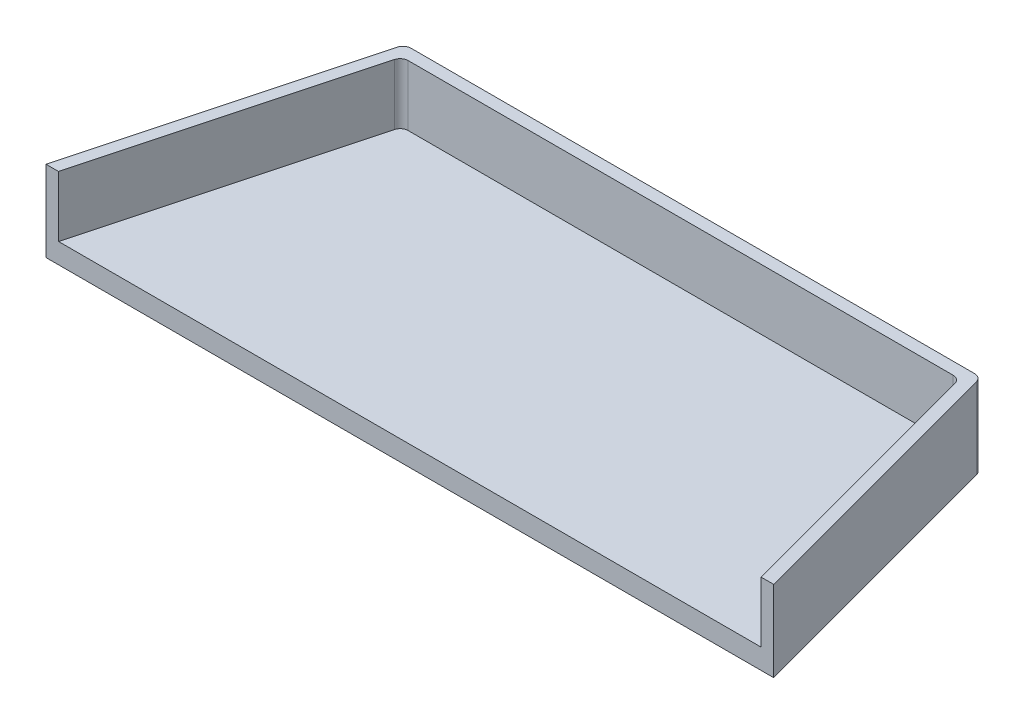
ISO-10303-21;
HEADER;
FILE_DESCRIPTION(('STEP AP214'),'2;1');
FILE_NAME('part.step','',(''),(''),'','','');
FILE_SCHEMA(('AUTOMOTIVE_DESIGN { 1 0 10303 214 1 1 1 1 }'));
ENDSEC;
DATA;
#1=APPLICATION_CONTEXT('core data for automotive mechanical design processes');
#2=APPLICATION_PROTOCOL_DEFINITION('international standard','automotive_design',2000,#1);
#3=PRODUCT_CONTEXT('',#1,'mechanical');
#4=PRODUCT('Part','Part','',(#3));
#5=PRODUCT_RELATED_PRODUCT_CATEGORY('part','',(#4));
#6=PRODUCT_DEFINITION_FORMATION('','',#4);
#7=PRODUCT_DEFINITION_CONTEXT('part definition',#1,'design');
#8=PRODUCT_DEFINITION('design','',#6,#7);
#9=PRODUCT_DEFINITION_SHAPE('','',#8);
#10=(LENGTH_UNIT() NAMED_UNIT(*) SI_UNIT(.MILLI.,.METRE.));
#11=(NAMED_UNIT(*) PLANE_ANGLE_UNIT() SI_UNIT($,.RADIAN.));
#12=(NAMED_UNIT(*) SI_UNIT($,.STERADIAN.) SOLID_ANGLE_UNIT());
#13=UNCERTAINTY_MEASURE_WITH_UNIT(LENGTH_MEASURE(1.E-05),#10,'distance_accuracy_value','');
#14=(GEOMETRIC_REPRESENTATION_CONTEXT(3) GLOBAL_UNCERTAINTY_ASSIGNED_CONTEXT((#13)) GLOBAL_UNIT_ASSIGNED_CONTEXT((#10,
#11,#12)) REPRESENTATION_CONTEXT('',''));
#15=CARTESIAN_POINT('',(0.,0.,0.));
#16=DIRECTION('',(0.,0.,1.));
#17=DIRECTION('',(1.,0.,0.));
#18=AXIS2_PLACEMENT_3D('',#15,#16,#17);
#19=CARTESIAN_POINT('',(71.2435565298211,5.,-70.));
#20=DIRECTION('',(-0.965925826289067,0.,0.258819045102525));
#21=DIRECTION('',(0.258819045102525,0.,0.965925826289067));
#22=AXIS2_PLACEMENT_3D('',#19,#20,#21);
#23=PLANE('',#22);
#24=DIRECTION('',(-0.258819045102525,0.,-0.965925826289067));
#25=VECTOR('',#24,1.);
#26=CARTESIAN_POINT('',(71.2435565298211,0.,-70.));
#27=LINE('',#26,#25);
#28=CARTESIAN_POINT('',(90.,0.,0.));
#29=VERTEX_POINT('',#28);
#30=CARTESIAN_POINT('',(71.6407542064413,0.,-68.517638090205));
#31=VERTEX_POINT('',#30);
#32=EDGE_CURVE('E201',#29,#31,#27,.T.);
#33=ORIENTED_EDGE('',*,*,#32,.T.);
#34=DIRECTION('',(0.,-1.,0.));
#35=VECTOR('',#34,1.);
#36=CARTESIAN_POINT('',(71.6407542064413,5.,-68.517638090205));
#37=LINE('',#36,#35);
#38=CARTESIAN_POINT('',(71.6407542064413,20.,-68.5176380902051));
#39=VERTEX_POINT('',#38);
#40=EDGE_CURVE('E151',#31,#39,#37,.F.);
#41=ORIENTED_EDGE('',*,*,#40,.T.);
#42=DIRECTION('',(-0.258819045102525,0.,-0.965925826289067));
#43=VECTOR('',#42,1.);
#44=CARTESIAN_POINT('',(90.,20.,0.));
#45=LINE('',#44,#43);
#46=CARTESIAN_POINT('',(90.,20.,0.));
#47=VERTEX_POINT('',#46);
#48=EDGE_CURVE('E149',#47,#39,#45,.T.);
#49=ORIENTED_EDGE('',*,*,#48,.F.);
#50=DIRECTION('',(0.,-1.,0.));
#51=VECTOR('',#50,1.);
#52=CARTESIAN_POINT('',(90.,5.,0.));
#53=LINE('',#52,#51);
#54=EDGE_CURVE('E132',#47,#29,#53,.T.);
#55=ORIENTED_EDGE('',*,*,#54,.T.);
#56=EDGE_LOOP('',(#33,#41,#49,#55));
#57=FACE_BOUND('',#56,.T.);
#58=ADVANCED_FACE('F42',(#57),#23,.F.);
#59=CARTESIAN_POINT('',(71.2435565298211,5.,-70.));
#60=DIRECTION('',(0.,0.,1.));
#61=DIRECTION('',(1.,0.,0.));
#62=AXIS2_PLACEMENT_3D('',#59,#60,#61);
#63=PLANE('',#62);
#64=DIRECTION('',(-1.,0.,0.));
#65=VECTOR('',#64,1.);
#66=CARTESIAN_POINT('',(71.2435565298211,0.,-70.));
#67=LINE('',#66,#65);
#68=CARTESIAN_POINT('',(69.7089025538632,0.,-70.));
#69=VERTEX_POINT('',#68);
#70=CARTESIAN_POINT('',(-69.7089025538632,0.,-70.));
#71=VERTEX_POINT('',#70);
#72=EDGE_CURVE('E207',#69,#71,#67,.T.);
#73=ORIENTED_EDGE('',*,*,#72,.T.);
#74=DIRECTION('',(0.,-1.,0.));
#75=VECTOR('',#74,1.);
#76=CARTESIAN_POINT('',(-69.7089025538632,5.,-70.));
#77=LINE('',#76,#75);
#78=CARTESIAN_POINT('',(-69.7089025538632,20.,-70.));
#79=VERTEX_POINT('',#78);
#80=EDGE_CURVE('E231',#71,#79,#77,.F.);
#81=ORIENTED_EDGE('',*,*,#80,.T.);
#82=DIRECTION('',(-1.,0.,0.));
#83=VECTOR('',#82,1.);
#84=CARTESIAN_POINT('',(71.2435565298211,20.,-70.));
#85=LINE('',#84,#83);
#86=CARTESIAN_POINT('',(69.7089025538632,20.,-70.));
#87=VERTEX_POINT('',#86);
#88=EDGE_CURVE('E155',#87,#79,#85,.T.);
#89=ORIENTED_EDGE('',*,*,#88,.F.);
#90=DIRECTION('',(0.,-1.,0.));
#91=VECTOR('',#90,1.);
#92=CARTESIAN_POINT('',(69.7089025538632,5.,-70.));
#93=LINE('',#92,#91);
#94=EDGE_CURVE('E227',#87,#69,#93,.T.);
#95=ORIENTED_EDGE('',*,*,#94,.T.);
#96=EDGE_LOOP('',(#73,#81,#89,#95));
#97=FACE_BOUND('',#96,.T.);
#98=ADVANCED_FACE('F288',(#97),#63,.F.);
#99=CARTESIAN_POINT('',(-71.2435565298211,5.,-70.));
#100=DIRECTION('',(0.965925826289067,0.,0.258819045102525));
#101=DIRECTION('',(0.258819045102525,0.,-0.965925826289067));
#102=AXIS2_PLACEMENT_3D('',#99,#100,#101);
#103=PLANE('',#102);
#104=DIRECTION('',(-0.258819045102525,0.,0.965925826289067));
#105=VECTOR('',#104,1.);
#106=CARTESIAN_POINT('',(-71.2435565298211,20.,-70.));
#107=LINE('',#106,#105);
#108=CARTESIAN_POINT('',(-71.6407542064413,20.,-68.517638090205));
#109=VERTEX_POINT('',#108);
#110=CARTESIAN_POINT('',(-90.,20.,0.));
#111=VERTEX_POINT('',#110);
#112=EDGE_CURVE('E172',#109,#111,#107,.T.);
#113=ORIENTED_EDGE('',*,*,#112,.F.);
#114=DIRECTION('',(0.,-1.,0.));
#115=VECTOR('',#114,1.);
#116=CARTESIAN_POINT('',(-71.6407542064413,5.,-68.517638090205));
#117=LINE('',#116,#115);
#118=CARTESIAN_POINT('',(-71.6407542064413,0.,-68.517638090205));
#119=VERTEX_POINT('',#118);
#120=EDGE_CURVE('E217',#109,#119,#117,.T.);
#121=ORIENTED_EDGE('',*,*,#120,.T.);
#122=DIRECTION('',(-0.258819045102525,0.,0.965925826289067));
#123=VECTOR('',#122,1.);
#124=CARTESIAN_POINT('',(-71.2435565298211,0.,-70.));
#125=LINE('',#124,#123);
#126=CARTESIAN_POINT('',(-90.,0.,0.));
#127=VERTEX_POINT('',#126);
#128=EDGE_CURVE('E211',#119,#127,#125,.T.);
#129=ORIENTED_EDGE('',*,*,#128,.T.);
#130=DIRECTION('',(0.,-1.,0.));
#131=VECTOR('',#130,1.);
#132=CARTESIAN_POINT('',(-90.,5.,0.));
#133=LINE('',#132,#131);
#134=EDGE_CURVE('E145',#111,#127,#133,.T.);
#135=ORIENTED_EDGE('',*,*,#134,.F.);
#136=EDGE_LOOP('',(#113,#121,#129,#135));
#137=FACE_BOUND('',#136,.T.);
#138=ADVANCED_FACE('F293',(#137),#103,.F.);
#139=CARTESIAN_POINT('',(-90.,5.,0.));
#140=DIRECTION('',(0.,0.,-1.));
#141=DIRECTION('',(-1.,0.,0.));
#142=AXIS2_PLACEMENT_3D('',#139,#140,#141);
#143=PLANE('',#142);
#144=DIRECTION('',(1.,0.,0.));
#145=VECTOR('',#144,1.);
#146=CARTESIAN_POINT('',(-90.,0.,0.));
#147=LINE('',#146,#145);
#148=EDGE_CURVE('E140',#127,#29,#147,.T.);
#149=ORIENTED_EDGE('',*,*,#148,.T.);
#150=ORIENTED_EDGE('',*,*,#54,.F.);
#151=DIRECTION('',(1.,0.,0.));
#152=VECTOR('',#151,1.);
#153=CARTESIAN_POINT('',(90.,20.,0.));
#154=LINE('',#153,#152);
#155=CARTESIAN_POINT('',(86.8941714587697,20.,0.));
#156=VERTEX_POINT('',#155);
#157=EDGE_CURVE('E137',#156,#47,#154,.T.);
#158=ORIENTED_EDGE('',*,*,#157,.F.);
#159=DIRECTION('',(0.,-1.,0.));
#160=VECTOR('',#159,1.);
#161=CARTESIAN_POINT('',(86.8941714587697,20.,0.));
#162=LINE('',#161,#160);
#163=CARTESIAN_POINT('',(86.8941714587697,5.,0.));
#164=VERTEX_POINT('',#163);
#165=EDGE_CURVE('E188',#156,#164,#162,.T.);
#166=ORIENTED_EDGE('',*,*,#165,.T.);
#167=DIRECTION('',(1.,0.,0.));
#168=VECTOR('',#167,1.);
#169=CARTESIAN_POINT('',(-90.,5.,0.));
#170=LINE('',#169,#168);
#171=CARTESIAN_POINT('',(-86.8941714587697,5.,0.));
#172=VERTEX_POINT('',#171);
#173=EDGE_CURVE('E146',#172,#164,#170,.T.);
#174=ORIENTED_EDGE('',*,*,#173,.F.);
#175=DIRECTION('',(0.,-1.,0.));
#176=VECTOR('',#175,1.);
#177=CARTESIAN_POINT('',(-86.8941714587697,20.,0.));
#178=LINE('',#177,#176);
#179=CARTESIAN_POINT('',(-86.8941714587697,20.,0.));
#180=VERTEX_POINT('',#179);
#181=EDGE_CURVE('E197',#180,#172,#178,.T.);
#182=ORIENTED_EDGE('',*,*,#181,.F.);
#183=DIRECTION('',(1.,0.,0.));
#184=VECTOR('',#183,1.);
#185=CARTESIAN_POINT('',(-86.8941714587697,20.,0.));
#186=LINE('',#185,#184);
#187=EDGE_CURVE('E175',#111,#180,#186,.T.);
#188=ORIENTED_EDGE('',*,*,#187,.F.);
#189=ORIENTED_EDGE('',*,*,#134,.T.);
#190=EDGE_LOOP('',(#149,#150,#158,#166,#174,#182,#188,#189));
#191=FACE_BOUND('',#190,.T.);
#192=ADVANCED_FACE('F134',(#191),#143,.F.);
#193=CARTESIAN_POINT('',(0.,5.,0.));
#194=DIRECTION('',(0.,1.,0.));
#195=DIRECTION('',(0.,0.,1.));
#196=AXIS2_PLACEMENT_3D('',#193,#194,#195);
#197=PLANE('',#196);
#198=DIRECTION('',(1.,0.,0.));
#199=VECTOR('',#198,1.);
#200=CARTESIAN_POINT('',(68.9415755658842,5.,-67.));
#201=LINE('',#200,#199);
#202=CARTESIAN_POINT('',(-67.4069215899263,5.,-67.));
#203=VERTEX_POINT('',#202);
#204=CARTESIAN_POINT('',(67.4069215899263,5.,-67.));
#205=VERTEX_POINT('',#204);
#206=EDGE_CURVE('E167',#203,#205,#201,.T.);
#207=ORIENTED_EDGE('',*,*,#206,.F.);
#208=CARTESIAN_POINT('',(-67.4069215899263,5.,-65.));
#209=DIRECTION('',(0.,1.,0.));
#210=DIRECTION('',(0.,0.,1.));
#211=AXIS2_PLACEMENT_3D('',#208,#209,#210);
#212=CIRCLE('',#211,2.);
#213=CARTESIAN_POINT('',(-69.3387732425044,5.,-65.517638090205));
#214=VERTEX_POINT('',#213);
#215=EDGE_CURVE('E58',#203,#214,#212,.T.);
#216=ORIENTED_EDGE('',*,*,#215,.T.);
#217=DIRECTION('',(0.258819045102525,0.,-0.965925826289067));
#218=VECTOR('',#217,1.);
#219=CARTESIAN_POINT('',(-68.9415755658842,5.,-67.));
#220=LINE('',#219,#218);
#221=EDGE_CURVE('E189',#172,#214,#220,.T.);
#222=ORIENTED_EDGE('',*,*,#221,.F.);
#223=ORIENTED_EDGE('',*,*,#173,.T.);
#224=DIRECTION('',(0.258819045102525,0.,0.965925826289067));
#225=VECTOR('',#224,1.);
#226=CARTESIAN_POINT('',(86.8941714587697,5.,0.));
#227=LINE('',#226,#225);
#228=CARTESIAN_POINT('',(69.3387732425045,5.,-65.5176380902051));
#229=VERTEX_POINT('',#228);
#230=EDGE_CURVE('E163',#229,#164,#227,.T.);
#231=ORIENTED_EDGE('',*,*,#230,.F.);
#232=CARTESIAN_POINT('',(67.4069215899263,5.,-65.));
#233=DIRECTION('',(0.,1.,0.));
#234=DIRECTION('',(0.,0.,1.));
#235=AXIS2_PLACEMENT_3D('',#232,#233,#234);
#236=CIRCLE('',#235,2.);
#237=EDGE_CURVE('E66',#229,#205,#236,.T.);
#238=ORIENTED_EDGE('',*,*,#237,.T.);
#239=EDGE_LOOP('',(#207,#216,#222,#223,#231,#238));
#240=FACE_BOUND('',#239,.T.);
#241=ADVANCED_FACE('F273',(#240),#197,.T.);
#242=CARTESIAN_POINT('',(0.,0.,0.));
#243=DIRECTION('',(0.,1.,0.));
#244=DIRECTION('',(0.,0.,1.));
#245=AXIS2_PLACEMENT_3D('',#242,#243,#244);
#246=PLANE('',#245);
#247=ORIENTED_EDGE('',*,*,#128,.F.);
#248=CARTESIAN_POINT('',(-69.7089025538632,0.,-68.));
#249=DIRECTION('',(0.,1.,0.));
#250=DIRECTION('',(0.,0.,1.));
#251=AXIS2_PLACEMENT_3D('',#248,#249,#250);
#252=CIRCLE('',#251,2.);
#253=EDGE_CURVE('E224',#119,#71,#252,.F.);
#254=ORIENTED_EDGE('',*,*,#253,.T.);
#255=ORIENTED_EDGE('',*,*,#72,.F.);
#256=CARTESIAN_POINT('',(69.7089025538632,0.,-68.));
#257=DIRECTION('',(0.,1.,0.));
#258=DIRECTION('',(0.,0.,1.));
#259=AXIS2_PLACEMENT_3D('',#256,#257,#258);
#260=CIRCLE('',#259,2.);
#261=EDGE_CURVE('E221',#69,#31,#260,.F.);
#262=ORIENTED_EDGE('',*,*,#261,.T.);
#263=ORIENTED_EDGE('',*,*,#32,.F.);
#264=ORIENTED_EDGE('',*,*,#148,.F.);
#265=EDGE_LOOP('',(#247,#254,#255,#262,#263,#264));
#266=FACE_BOUND('',#265,.T.);
#267=ADVANCED_FACE('F313',(#266),#246,.F.);
#268=CARTESIAN_POINT('',(-68.9415755658842,20.,-67.));
#269=DIRECTION('',(-0.965925826289067,0.,-0.258819045102525));
#270=DIRECTION('',(-0.258819045102525,0.,0.965925826289067));
#271=AXIS2_PLACEMENT_3D('',#268,#269,#270);
#272=PLANE('',#271);
#273=ORIENTED_EDGE('',*,*,#221,.T.);
#274=DIRECTION('',(0.,-1.,0.));
#275=VECTOR('',#274,1.);
#276=CARTESIAN_POINT('',(-69.3387732425044,20.,-65.517638090205));
#277=LINE('',#276,#275);
#278=CARTESIAN_POINT('',(-69.3387732425044,20.,-65.517638090205));
#279=VERTEX_POINT('',#278);
#280=EDGE_CURVE('E251',#214,#279,#277,.F.);
#281=ORIENTED_EDGE('',*,*,#280,.T.);
#282=DIRECTION('',(0.258819045102525,0.,-0.965925826289067));
#283=VECTOR('',#282,1.);
#284=CARTESIAN_POINT('',(-68.9415755658842,20.,-67.));
#285=LINE('',#284,#283);
#286=EDGE_CURVE('E178',#180,#279,#285,.T.);
#287=ORIENTED_EDGE('',*,*,#286,.F.);
#288=ORIENTED_EDGE('',*,*,#181,.T.);
#289=EDGE_LOOP('',(#273,#281,#287,#288));
#290=FACE_BOUND('',#289,.T.);
#291=ADVANCED_FACE('F270',(#290),#272,.F.);
#292=CARTESIAN_POINT('',(68.9415755658842,20.,-67.));
#293=DIRECTION('',(0.,0.,-1.));
#294=DIRECTION('',(-1.,0.,0.));
#295=AXIS2_PLACEMENT_3D('',#292,#293,#294);
#296=PLANE('',#295);
#297=DIRECTION('',(1.,0.,0.));
#298=VECTOR('',#297,1.);
#299=CARTESIAN_POINT('',(68.9415755658842,20.,-67.));
#300=LINE('',#299,#298);
#301=CARTESIAN_POINT('',(-67.4069215899263,20.,-67.));
#302=VERTEX_POINT('',#301);
#303=CARTESIAN_POINT('',(67.4069215899263,20.,-67.));
#304=VERTEX_POINT('',#303);
#305=EDGE_CURVE('E182',#302,#304,#300,.T.);
#306=ORIENTED_EDGE('',*,*,#305,.F.);
#307=DIRECTION('',(0.,-1.,0.));
#308=VECTOR('',#307,1.);
#309=CARTESIAN_POINT('',(-67.4069215899263,5.,-67.));
#310=LINE('',#309,#308);
#311=EDGE_CURVE('E243',#302,#203,#310,.T.);
#312=ORIENTED_EDGE('',*,*,#311,.T.);
#313=ORIENTED_EDGE('',*,*,#206,.T.);
#314=DIRECTION('',(0.,-1.,0.));
#315=VECTOR('',#314,1.);
#316=CARTESIAN_POINT('',(67.4069215899263,20.,-67.));
#317=LINE('',#316,#315);
#318=EDGE_CURVE('E240',#205,#304,#317,.F.);
#319=ORIENTED_EDGE('',*,*,#318,.T.);
#320=EDGE_LOOP('',(#306,#312,#313,#319));
#321=FACE_BOUND('',#320,.T.);
#322=ADVANCED_FACE('F267',(#321),#296,.F.);
#323=CARTESIAN_POINT('',(86.8941714587697,20.,0.));
#324=DIRECTION('',(0.965925826289067,0.,-0.258819045102525));
#325=DIRECTION('',(-0.258819045102525,0.,-0.965925826289067));
#326=AXIS2_PLACEMENT_3D('',#323,#324,#325);
#327=PLANE('',#326);
#328=DIRECTION('',(0.258819045102525,0.,0.965925826289067));
#329=VECTOR('',#328,1.);
#330=CARTESIAN_POINT('',(86.8941714587697,20.,0.));
#331=LINE('',#330,#329);
#332=CARTESIAN_POINT('',(69.3387732425045,20.,-65.5176380902051));
#333=VERTEX_POINT('',#332);
#334=EDGE_CURVE('E160',#333,#156,#331,.T.);
#335=ORIENTED_EDGE('',*,*,#334,.F.);
#336=DIRECTION('',(0.,-1.,0.));
#337=VECTOR('',#336,1.);
#338=CARTESIAN_POINT('',(69.3387732425045,5.,-65.517638090205));
#339=LINE('',#338,#337);
#340=EDGE_CURVE('E254',#333,#229,#339,.T.);
#341=ORIENTED_EDGE('',*,*,#340,.T.);
#342=ORIENTED_EDGE('',*,*,#230,.T.);
#343=ORIENTED_EDGE('',*,*,#165,.F.);
#344=EDGE_LOOP('',(#335,#341,#342,#343));
#345=FACE_BOUND('',#344,.T.);
#346=ADVANCED_FACE('F277',(#345),#327,.F.);
#347=CARTESIAN_POINT('',(0.,20.,0.));
#348=DIRECTION('',(0.,-1.,0.));
#349=DIRECTION('',(0.,0.,-1.));
#350=AXIS2_PLACEMENT_3D('',#347,#348,#349);
#351=PLANE('',#350);
#352=ORIENTED_EDGE('',*,*,#88,.T.);
#353=CARTESIAN_POINT('',(-69.7089025538632,20.,-68.));
#354=DIRECTION('',(0.,-1.,0.));
#355=DIRECTION('',(0.,0.,-1.));
#356=AXIS2_PLACEMENT_3D('',#353,#354,#355);
#357=CIRCLE('',#356,2.);
#358=EDGE_CURVE('E237',#79,#109,#357,.F.);
#359=ORIENTED_EDGE('',*,*,#358,.T.);
#360=ORIENTED_EDGE('',*,*,#112,.T.);
#361=ORIENTED_EDGE('',*,*,#187,.T.);
#362=ORIENTED_EDGE('',*,*,#286,.T.);
#363=CARTESIAN_POINT('',(-67.4069215899263,20.,-65.));
#364=DIRECTION('',(0.,-1.,0.));
#365=DIRECTION('',(0.,0.,-1.));
#366=AXIS2_PLACEMENT_3D('',#363,#364,#365);
#367=CIRCLE('',#366,2.);
#368=EDGE_CURVE('E51',#279,#302,#367,.T.);
#369=ORIENTED_EDGE('',*,*,#368,.T.);
#370=ORIENTED_EDGE('',*,*,#305,.T.);
#371=CARTESIAN_POINT('',(67.4069215899263,20.,-65.));
#372=DIRECTION('',(0.,-1.,0.));
#373=DIRECTION('',(0.,0.,-1.));
#374=AXIS2_PLACEMENT_3D('',#371,#372,#373);
#375=CIRCLE('',#374,2.);
#376=EDGE_CURVE('E11',#304,#333,#375,.T.);
#377=ORIENTED_EDGE('',*,*,#376,.T.);
#378=ORIENTED_EDGE('',*,*,#334,.T.);
#379=ORIENTED_EDGE('',*,*,#157,.T.);
#380=ORIENTED_EDGE('',*,*,#48,.T.);
#381=CARTESIAN_POINT('',(69.7089025538632,20.,-68.));
#382=DIRECTION('',(0.,-1.,0.));
#383=DIRECTION('',(0.,0.,-1.));
#384=AXIS2_PLACEMENT_3D('',#381,#382,#383);
#385=CIRCLE('',#384,2.);
#386=EDGE_CURVE('E234',#39,#87,#385,.F.);
#387=ORIENTED_EDGE('',*,*,#386,.T.);
#388=EDGE_LOOP('',(#352,#359,#360,#361,#362,#369,#370,#377,#378,#379,#380,#387));
#389=FACE_BOUND('',#388,.T.);
#390=ADVANCED_FACE('F158',(#389),#351,.F.);
#391=CARTESIAN_POINT('',(-69.7089025538632,5.,-68.));
#392=DIRECTION('',(0.,-1.,0.));
#393=DIRECTION('',(0.,0.,-1.));
#394=AXIS2_PLACEMENT_3D('',#391,#392,#393);
#395=CYLINDRICAL_SURFACE('',#394,2.);
#396=ORIENTED_EDGE('',*,*,#358,.F.);
#397=ORIENTED_EDGE('',*,*,#80,.F.);
#398=ORIENTED_EDGE('',*,*,#253,.F.);
#399=ORIENTED_EDGE('',*,*,#120,.F.);
#400=EDGE_LOOP('',(#396,#397,#398,#399));
#401=FACE_BOUND('',#400,.T.);
#402=ADVANCED_FACE('F285',(#401),#395,.T.);
#403=CARTESIAN_POINT('',(-67.4069215899263,20.,-65.));
#404=DIRECTION('',(0.,1.,0.));
#405=DIRECTION('',(0.,0.,1.));
#406=AXIS2_PLACEMENT_3D('',#403,#404,#405);
#407=CYLINDRICAL_SURFACE('',#406,2.);
#408=ORIENTED_EDGE('',*,*,#368,.F.);
#409=ORIENTED_EDGE('',*,*,#280,.F.);
#410=ORIENTED_EDGE('',*,*,#215,.F.);
#411=ORIENTED_EDGE('',*,*,#311,.F.);
#412=EDGE_LOOP('',(#408,#409,#410,#411));
#413=FACE_BOUND('',#412,.T.);
#414=ADVANCED_FACE('F268',(#413),#407,.F.);
#415=CARTESIAN_POINT('',(67.4069215899263,20.,-65.));
#416=DIRECTION('',(0.,1.,0.));
#417=DIRECTION('',(0.,0.,1.));
#418=AXIS2_PLACEMENT_3D('',#415,#416,#417);
#419=CYLINDRICAL_SURFACE('',#418,2.);
#420=ORIENTED_EDGE('',*,*,#376,.F.);
#421=ORIENTED_EDGE('',*,*,#318,.F.);
#422=ORIENTED_EDGE('',*,*,#237,.F.);
#423=ORIENTED_EDGE('',*,*,#340,.F.);
#424=EDGE_LOOP('',(#420,#421,#422,#423));
#425=FACE_BOUND('',#424,.T.);
#426=ADVANCED_FACE('F278',(#425),#419,.F.);
#427=CARTESIAN_POINT('',(69.7089025538632,5.,-68.));
#428=DIRECTION('',(0.,-1.,0.));
#429=DIRECTION('',(0.,0.,-1.));
#430=AXIS2_PLACEMENT_3D('',#427,#428,#429);
#431=CYLINDRICAL_SURFACE('',#430,2.);
#432=ORIENTED_EDGE('',*,*,#386,.F.);
#433=ORIENTED_EDGE('',*,*,#40,.F.);
#434=ORIENTED_EDGE('',*,*,#261,.F.);
#435=ORIENTED_EDGE('',*,*,#94,.F.);
#436=EDGE_LOOP('',(#432,#433,#434,#435));
#437=FACE_BOUND('',#436,.T.);
#438=ADVANCED_FACE('F44',(#437),#431,.T.);
#439=CLOSED_SHELL('',(#58,#98,#138,#192,#241,#267,#291,#322,#346,#390,#402,#414,#426,#438));
#440=MANIFOLD_SOLID_BREP('B2',#439);
#441=ADVANCED_BREP_SHAPE_REPRESENTATION('',(#18,#440),#14);
#442=SHAPE_DEFINITION_REPRESENTATION(#9,#441);
ENDSEC;
END-ISO-10303-21;
